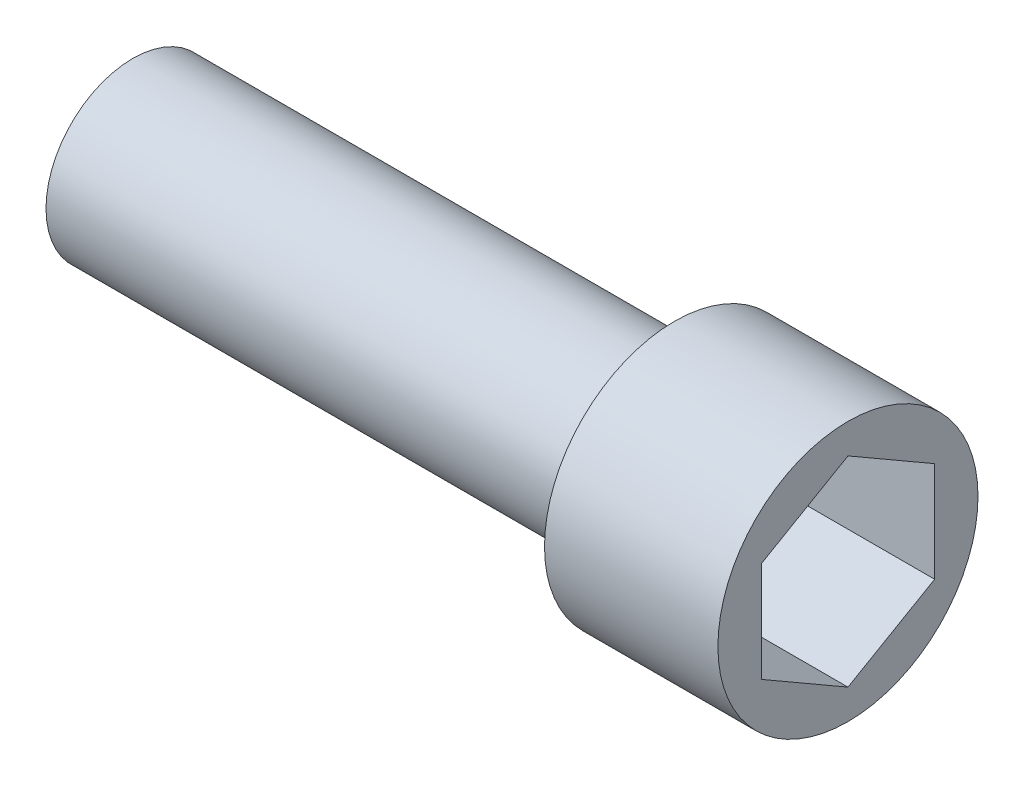
ISO-10303-21;
HEADER;
FILE_DESCRIPTION(('STEP AP214'),'2;1');
FILE_NAME('part.step','',(''),(''),'','','');
FILE_SCHEMA(('AUTOMOTIVE_DESIGN { 1 0 10303 214 1 1 1 1 }'));
ENDSEC;
DATA;
#1=APPLICATION_CONTEXT('core data for automotive mechanical design processes');
#2=APPLICATION_PROTOCOL_DEFINITION('international standard','automotive_design',2000,#1);
#3=PRODUCT_CONTEXT('',#1,'mechanical');
#4=PRODUCT('Part','Part','',(#3));
#5=PRODUCT_RELATED_PRODUCT_CATEGORY('part','',(#4));
#6=PRODUCT_DEFINITION_FORMATION('','',#4);
#7=PRODUCT_DEFINITION_CONTEXT('part definition',#1,'design');
#8=PRODUCT_DEFINITION('design','',#6,#7);
#9=PRODUCT_DEFINITION_SHAPE('','',#8);
#10=(LENGTH_UNIT() NAMED_UNIT(*) SI_UNIT(.MILLI.,.METRE.));
#11=(NAMED_UNIT(*) PLANE_ANGLE_UNIT() SI_UNIT($,.RADIAN.));
#12=(NAMED_UNIT(*) SI_UNIT($,.STERADIAN.) SOLID_ANGLE_UNIT());
#13=UNCERTAINTY_MEASURE_WITH_UNIT(LENGTH_MEASURE(1.E-05),#10,'distance_accuracy_value','');
#14=(GEOMETRIC_REPRESENTATION_CONTEXT(3) GLOBAL_UNCERTAINTY_ASSIGNED_CONTEXT((#13)) GLOBAL_UNIT_ASSIGNED_CONTEXT((#10,
#11,#12)) REPRESENTATION_CONTEXT('',''));
#15=CARTESIAN_POINT('',(0.,0.,0.));
#16=DIRECTION('',(0.,0.,1.));
#17=DIRECTION('',(1.,0.,0.));
#18=AXIS2_PLACEMENT_3D('',#15,#16,#17);
#19=CARTESIAN_POINT('',(8.,0.,0.));
#20=DIRECTION('',(-1.,0.,0.));
#21=DIRECTION('',(0.,0.,1.));
#22=AXIS2_PLACEMENT_3D('',#19,#20,#21);
#23=CYLINDRICAL_SURFACE('',#22,6.);
#24=CARTESIAN_POINT('',(8.,0.,0.));
#25=DIRECTION('',(1.,0.,0.));
#26=DIRECTION('',(0.,0.,-1.));
#27=AXIS2_PLACEMENT_3D('',#24,#25,#26);
#28=CIRCLE('',#27,6.);
#29=CARTESIAN_POINT('',(8.,0.,-6.));
#30=VERTEX_POINT('',#29);
#31=EDGE_CURVE('E54',#30,#30,#28,.T.);
#32=ORIENTED_EDGE('',*,*,#31,.F.);
#33=EDGE_LOOP('',(#32));
#34=FACE_BOUND('',#33,.T.);
#35=CARTESIAN_POINT('',(0.,0.,0.));
#36=DIRECTION('',(1.,0.,0.));
#37=DIRECTION('',(0.,0.,-1.));
#38=AXIS2_PLACEMENT_3D('',#35,#36,#37);
#39=CIRCLE('',#38,6.);
#40=CARTESIAN_POINT('',(0.,0.,-6.));
#41=VERTEX_POINT('',#40);
#42=EDGE_CURVE('E48',#41,#41,#39,.T.);
#43=ORIENTED_EDGE('',*,*,#42,.T.);
#44=EDGE_LOOP('',(#43));
#45=FACE_BOUND('',#44,.T.);
#46=ADVANCED_FACE('F45',(#34,#45),#23,.T.);
#47=CARTESIAN_POINT('',(8.,0.,0.));
#48=DIRECTION('',(1.,0.,0.));
#49=DIRECTION('',(0.,0.,-1.));
#50=AXIS2_PLACEMENT_3D('',#47,#48,#49);
#51=PLANE('',#50);
#52=DIRECTION('',(0.,0.5,0.866025403784439));
#53=VECTOR('',#52,1.);
#54=CARTESIAN_POINT('',(8.,2.3094010767585,-4.));
#55=LINE('',#54,#53);
#56=CARTESIAN_POINT('',(8.,2.3094010767585,-4.));
#57=VERTEX_POINT('',#56);
#58=CARTESIAN_POINT('',(8.,4.61880215351701,0.));
#59=VERTEX_POINT('',#58);
#60=EDGE_CURVE('E62',#57,#59,#55,.T.);
#61=ORIENTED_EDGE('',*,*,#60,.F.);
#62=DIRECTION('',(0.,1.,0.));
#63=VECTOR('',#62,1.);
#64=CARTESIAN_POINT('',(8.,-2.3094010767585,-4.));
#65=LINE('',#64,#63);
#66=CARTESIAN_POINT('',(8.,-2.3094010767585,-4.));
#67=VERTEX_POINT('',#66);
#68=EDGE_CURVE('E156',#67,#57,#65,.T.);
#69=ORIENTED_EDGE('',*,*,#68,.F.);
#70=DIRECTION('',(0.,0.5,-0.866025403784439));
#71=VECTOR('',#70,1.);
#72=CARTESIAN_POINT('',(8.,-4.61880215351701,0.));
#73=LINE('',#72,#71);
#74=CARTESIAN_POINT('',(8.,-4.61880215351701,0.));
#75=VERTEX_POINT('',#74);
#76=EDGE_CURVE('E153',#75,#67,#73,.T.);
#77=ORIENTED_EDGE('',*,*,#76,.F.);
#78=DIRECTION('',(0.,-0.5,-0.866025403784438));
#79=VECTOR('',#78,1.);
#80=CARTESIAN_POINT('',(8.,-2.3094010767585,4.));
#81=LINE('',#80,#79);
#82=CARTESIAN_POINT('',(8.,-2.3094010767585,4.));
#83=VERTEX_POINT('',#82);
#84=EDGE_CURVE('E110',#83,#75,#81,.T.);
#85=ORIENTED_EDGE('',*,*,#84,.F.);
#86=DIRECTION('',(0.,-1.,0.));
#87=VECTOR('',#86,1.);
#88=CARTESIAN_POINT('',(8.,2.3094010767585,4.));
#89=LINE('',#88,#87);
#90=CARTESIAN_POINT('',(8.,2.3094010767585,4.));
#91=VERTEX_POINT('',#90);
#92=EDGE_CURVE('E147',#91,#83,#89,.T.);
#93=ORIENTED_EDGE('',*,*,#92,.F.);
#94=DIRECTION('',(0.,-0.5,0.866025403784439));
#95=VECTOR('',#94,1.);
#96=CARTESIAN_POINT('',(8.,4.61880215351701,0.));
#97=LINE('',#96,#95);
#98=EDGE_CURVE('E142',#59,#91,#97,.T.);
#99=ORIENTED_EDGE('',*,*,#98,.F.);
#100=EDGE_LOOP('',(#61,#69,#77,#85,#93,#99));
#101=FACE_BOUND('',#100,.T.);
#102=ORIENTED_EDGE('',*,*,#31,.T.);
#103=EDGE_LOOP('',(#102));
#104=FACE_BOUND('',#103,.T.);
#105=ADVANCED_FACE('F182',(#101,#104),#51,.T.);
#106=CARTESIAN_POINT('',(0.,0.,0.));
#107=DIRECTION('',(1.,0.,0.));
#108=DIRECTION('',(0.,0.,-1.));
#109=AXIS2_PLACEMENT_3D('',#106,#107,#108);
#110=PLANE('',#109);
#111=CARTESIAN_POINT('',(0.,0.,0.));
#112=DIRECTION('',(-1.,0.,0.));
#113=DIRECTION('',(0.,0.,1.));
#114=AXIS2_PLACEMENT_3D('',#111,#112,#113);
#115=CIRCLE('',#114,4.);
#116=CARTESIAN_POINT('',(0.,0.,4.));
#117=VERTEX_POINT('',#116);
#118=EDGE_CURVE('E11',#117,#117,#115,.T.);
#119=ORIENTED_EDGE('',*,*,#118,.F.);
#120=EDGE_LOOP('',(#119));
#121=FACE_BOUND('',#120,.T.);
#122=ORIENTED_EDGE('',*,*,#42,.F.);
#123=EDGE_LOOP('',(#122));
#124=FACE_BOUND('',#123,.T.);
#125=ADVANCED_FACE('F179',(#121,#124),#110,.F.);
#126=CARTESIAN_POINT('',(2.,2.3094010767585,-4.));
#127=DIRECTION('',(0.,0.866025403784438,-0.5));
#128=DIRECTION('',(0.,0.5,0.866025403784439));
#129=AXIS2_PLACEMENT_3D('',#126,#127,#128);
#130=PLANE('',#129);
#131=ORIENTED_EDGE('',*,*,#60,.T.);
#132=DIRECTION('',(1.,0.,0.));
#133=VECTOR('',#132,1.);
#134=CARTESIAN_POINT('',(2.,4.61880215351701,0.));
#135=LINE('',#134,#133);
#136=CARTESIAN_POINT('',(2.,4.61880215351701,0.));
#137=VERTEX_POINT('',#136);
#138=EDGE_CURVE('E92',#137,#59,#135,.T.);
#139=ORIENTED_EDGE('',*,*,#138,.F.);
#140=DIRECTION('',(0.,0.5,0.866025403784439));
#141=VECTOR('',#140,1.);
#142=CARTESIAN_POINT('',(2.,2.3094010767585,-4.));
#143=LINE('',#142,#141);
#144=CARTESIAN_POINT('',(2.,2.3094010767585,-4.));
#145=VERTEX_POINT('',#144);
#146=EDGE_CURVE('E159',#145,#137,#143,.T.);
#147=ORIENTED_EDGE('',*,*,#146,.F.);
#148=DIRECTION('',(1.,0.,0.));
#149=VECTOR('',#148,1.);
#150=CARTESIAN_POINT('',(2.,2.3094010767585,-4.));
#151=LINE('',#150,#149);
#152=EDGE_CURVE('E70',#145,#57,#151,.T.);
#153=ORIENTED_EDGE('',*,*,#152,.T.);
#154=EDGE_LOOP('',(#131,#139,#147,#153));
#155=FACE_BOUND('',#154,.T.);
#156=ADVANCED_FACE('F181',(#155),#130,.F.);
#157=CARTESIAN_POINT('',(2.,-2.3094010767585,-4.));
#158=DIRECTION('',(0.,0.,-1.));
#159=DIRECTION('',(-1.,0.,0.));
#160=AXIS2_PLACEMENT_3D('',#157,#158,#159);
#161=PLANE('',#160);
#162=ORIENTED_EDGE('',*,*,#68,.T.);
#163=ORIENTED_EDGE('',*,*,#152,.F.);
#164=DIRECTION('',(0.,1.,0.));
#165=VECTOR('',#164,1.);
#166=CARTESIAN_POINT('',(2.,-2.3094010767585,-4.));
#167=LINE('',#166,#165);
#168=CARTESIAN_POINT('',(2.,-2.3094010767585,-4.));
#169=VERTEX_POINT('',#168);
#170=EDGE_CURVE('E124',#169,#145,#167,.T.);
#171=ORIENTED_EDGE('',*,*,#170,.F.);
#172=DIRECTION('',(1.,0.,0.));
#173=VECTOR('',#172,1.);
#174=CARTESIAN_POINT('',(2.,-2.3094010767585,-4.));
#175=LINE('',#174,#173);
#176=EDGE_CURVE('E115',#169,#67,#175,.T.);
#177=ORIENTED_EDGE('',*,*,#176,.T.);
#178=EDGE_LOOP('',(#162,#163,#171,#177));
#179=FACE_BOUND('',#178,.T.);
#180=ADVANCED_FACE('F189',(#179),#161,.F.);
#181=CARTESIAN_POINT('',(2.,-4.61880215351701,0.));
#182=DIRECTION('',(0.,-0.866025403784439,-0.5));
#183=DIRECTION('',(0.,0.5,-0.866025403784439));
#184=AXIS2_PLACEMENT_3D('',#181,#182,#183);
#185=PLANE('',#184);
#186=ORIENTED_EDGE('',*,*,#76,.T.);
#187=ORIENTED_EDGE('',*,*,#176,.F.);
#188=DIRECTION('',(0.,0.5,-0.866025403784439));
#189=VECTOR('',#188,1.);
#190=CARTESIAN_POINT('',(2.,-4.61880215351701,0.));
#191=LINE('',#190,#189);
#192=CARTESIAN_POINT('',(2.,-4.61880215351701,0.));
#193=VERTEX_POINT('',#192);
#194=EDGE_CURVE('E119',#193,#169,#191,.T.);
#195=ORIENTED_EDGE('',*,*,#194,.F.);
#196=DIRECTION('',(1.,0.,0.));
#197=VECTOR('',#196,1.);
#198=CARTESIAN_POINT('',(2.,-4.61880215351701,0.));
#199=LINE('',#198,#197);
#200=EDGE_CURVE('E103',#193,#75,#199,.T.);
#201=ORIENTED_EDGE('',*,*,#200,.T.);
#202=EDGE_LOOP('',(#186,#187,#195,#201));
#203=FACE_BOUND('',#202,.T.);
#204=ADVANCED_FACE('F120',(#203),#185,.F.);
#205=CARTESIAN_POINT('',(2.,-2.3094010767585,4.));
#206=DIRECTION('',(0.,-0.866025403784438,0.5));
#207=DIRECTION('',(0.,-0.5,-0.866025403784439));
#208=AXIS2_PLACEMENT_3D('',#205,#206,#207);
#209=PLANE('',#208);
#210=ORIENTED_EDGE('',*,*,#84,.T.);
#211=ORIENTED_EDGE('',*,*,#200,.F.);
#212=DIRECTION('',(0.,-0.5,-0.866025403784438));
#213=VECTOR('',#212,1.);
#214=CARTESIAN_POINT('',(2.,-2.3094010767585,4.));
#215=LINE('',#214,#213);
#216=CARTESIAN_POINT('',(2.,-2.3094010767585,4.));
#217=VERTEX_POINT('',#216);
#218=EDGE_CURVE('E107',#217,#193,#215,.T.);
#219=ORIENTED_EDGE('',*,*,#218,.F.);
#220=DIRECTION('',(1.,0.,0.));
#221=VECTOR('',#220,1.);
#222=CARTESIAN_POINT('',(2.,-2.3094010767585,4.));
#223=LINE('',#222,#221);
#224=EDGE_CURVE('E116',#217,#83,#223,.T.);
#225=ORIENTED_EDGE('',*,*,#224,.T.);
#226=EDGE_LOOP('',(#210,#211,#219,#225));
#227=FACE_BOUND('',#226,.T.);
#228=ADVANCED_FACE('F105',(#227),#209,.F.);
#229=CARTESIAN_POINT('',(2.,2.3094010767585,4.));
#230=DIRECTION('',(0.,0.,1.));
#231=DIRECTION('',(0.,-1.,0.));
#232=AXIS2_PLACEMENT_3D('',#229,#230,#231);
#233=PLANE('',#232);
#234=ORIENTED_EDGE('',*,*,#92,.T.);
#235=ORIENTED_EDGE('',*,*,#224,.F.);
#236=DIRECTION('',(0.,-1.,0.));
#237=VECTOR('',#236,1.);
#238=CARTESIAN_POINT('',(2.,2.3094010767585,4.));
#239=LINE('',#238,#237);
#240=CARTESIAN_POINT('',(2.,2.3094010767585,4.));
#241=VERTEX_POINT('',#240);
#242=EDGE_CURVE('E130',#241,#217,#239,.T.);
#243=ORIENTED_EDGE('',*,*,#242,.F.);
#244=DIRECTION('',(1.,0.,0.));
#245=VECTOR('',#244,1.);
#246=CARTESIAN_POINT('',(2.,2.3094010767585,4.));
#247=LINE('',#246,#245);
#248=EDGE_CURVE('E166',#241,#91,#247,.T.);
#249=ORIENTED_EDGE('',*,*,#248,.T.);
#250=EDGE_LOOP('',(#234,#235,#243,#249));
#251=FACE_BOUND('',#250,.T.);
#252=ADVANCED_FACE('F230',(#251),#233,.F.);
#253=CARTESIAN_POINT('',(2.,4.61880215351701,0.));
#254=DIRECTION('',(0.,0.866025403784438,0.5));
#255=DIRECTION('',(0.,-0.5,0.866025403784439));
#256=AXIS2_PLACEMENT_3D('',#253,#254,#255);
#257=PLANE('',#256);
#258=ORIENTED_EDGE('',*,*,#98,.T.);
#259=ORIENTED_EDGE('',*,*,#248,.F.);
#260=DIRECTION('',(0.,-0.5,0.866025403784439));
#261=VECTOR('',#260,1.);
#262=CARTESIAN_POINT('',(2.,4.61880215351701,0.));
#263=LINE('',#262,#261);
#264=EDGE_CURVE('E134',#137,#241,#263,.T.);
#265=ORIENTED_EDGE('',*,*,#264,.F.);
#266=ORIENTED_EDGE('',*,*,#138,.T.);
#267=EDGE_LOOP('',(#258,#259,#265,#266));
#268=FACE_BOUND('',#267,.T.);
#269=ADVANCED_FACE('F238',(#268),#257,.F.);
#270=CARTESIAN_POINT('',(2.,0.,0.));
#271=DIRECTION('',(1.,0.,0.));
#272=DIRECTION('',(0.,0.,-1.));
#273=AXIS2_PLACEMENT_3D('',#270,#271,#272);
#274=PLANE('',#273);
#275=ORIENTED_EDGE('',*,*,#146,.T.);
#276=ORIENTED_EDGE('',*,*,#264,.T.);
#277=ORIENTED_EDGE('',*,*,#242,.T.);
#278=ORIENTED_EDGE('',*,*,#218,.T.);
#279=ORIENTED_EDGE('',*,*,#194,.T.);
#280=ORIENTED_EDGE('',*,*,#170,.T.);
#281=EDGE_LOOP('',(#275,#276,#277,#278,#279,#280));
#282=FACE_BOUND('',#281,.T.);
#283=ADVANCED_FACE('F127',(#282),#274,.T.);
#284=CARTESIAN_POINT('',(-25.,0.,0.));
#285=DIRECTION('',(1.,0.,0.));
#286=DIRECTION('',(0.,0.,-1.));
#287=AXIS2_PLACEMENT_3D('',#284,#285,#286);
#288=CYLINDRICAL_SURFACE('',#287,4.);
#289=CARTESIAN_POINT('',(-25.,0.,0.));
#290=DIRECTION('',(-1.,0.,0.));
#291=DIRECTION('',(0.,0.,1.));
#292=AXIS2_PLACEMENT_3D('',#289,#290,#291);
#293=CIRCLE('',#292,4.);
#294=CARTESIAN_POINT('',(-25.,0.,4.));
#295=VERTEX_POINT('',#294);
#296=EDGE_CURVE('E143',#295,#295,#293,.T.);
#297=ORIENTED_EDGE('',*,*,#296,.F.);
#298=EDGE_LOOP('',(#297));
#299=FACE_BOUND('',#298,.T.);
#300=ORIENTED_EDGE('',*,*,#118,.T.);
#301=EDGE_LOOP('',(#300));
#302=FACE_BOUND('',#301,.T.);
#303=ADVANCED_FACE('F253',(#299,#302),#288,.T.);
#304=CARTESIAN_POINT('',(-25.,0.,0.));
#305=DIRECTION('',(-1.,0.,0.));
#306=DIRECTION('',(0.,0.,1.));
#307=AXIS2_PLACEMENT_3D('',#304,#305,#306);
#308=PLANE('',#307);
#309=ORIENTED_EDGE('',*,*,#296,.T.);
#310=EDGE_LOOP('',(#309));
#311=FACE_BOUND('',#310,.T.);
#312=ADVANCED_FACE('F264',(#311),#308,.T.);
#313=CLOSED_SHELL('',(#46,#105,#125,#156,#180,#204,#228,#252,#269,#283,#303,#312));
#314=MANIFOLD_SOLID_BREP('B2',#313);
#315=ADVANCED_BREP_SHAPE_REPRESENTATION('',(#18,#314),#14);
#316=SHAPE_DEFINITION_REPRESENTATION(#9,#315);
ENDSEC;
END-ISO-10303-21;
